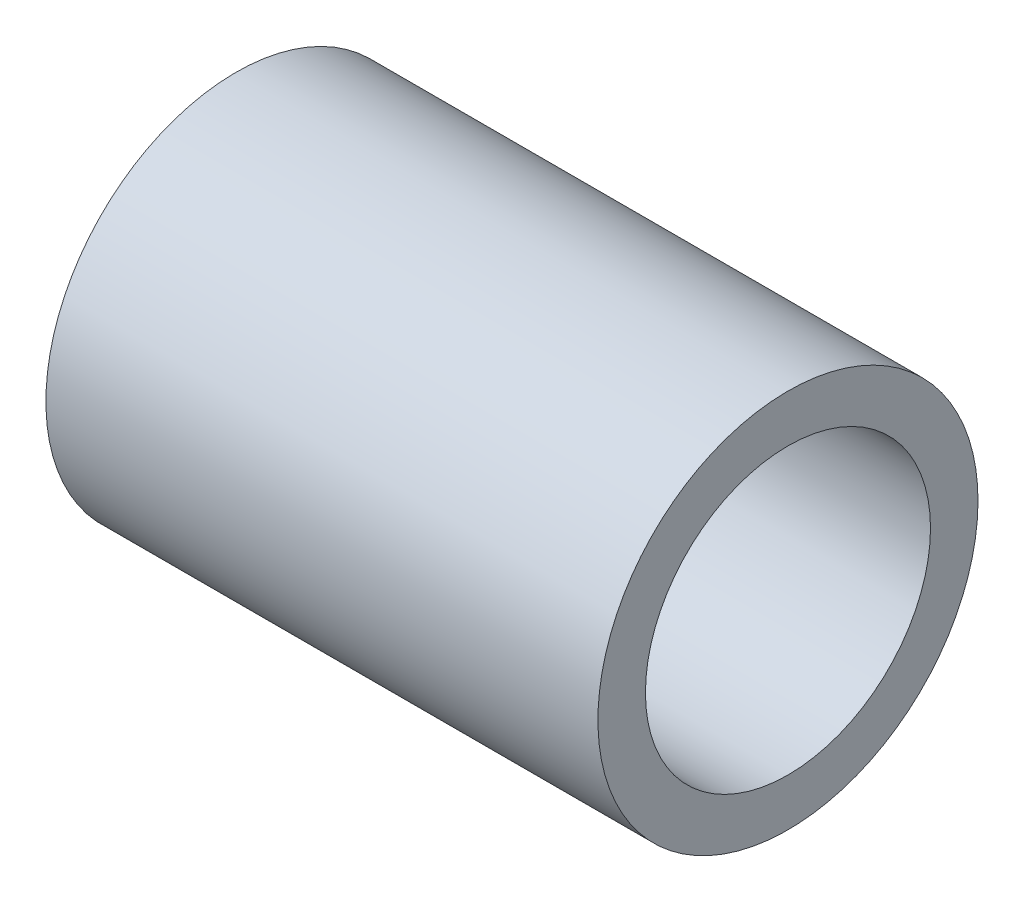
ISO-10303-21;
HEADER;
FILE_DESCRIPTION(('STEP AP214'),'2;1');
FILE_NAME('part.step','',(''),(''),'','','');
FILE_SCHEMA(('AUTOMOTIVE_DESIGN { 1 0 10303 214 1 1 1 1 }'));
ENDSEC;
DATA;
#1=APPLICATION_CONTEXT('core data for automotive mechanical design processes');
#2=APPLICATION_PROTOCOL_DEFINITION('international standard','automotive_design',2000,#1);
#3=PRODUCT_CONTEXT('',#1,'mechanical');
#4=PRODUCT('Part','Part','',(#3));
#5=PRODUCT_RELATED_PRODUCT_CATEGORY('part','',(#4));
#6=PRODUCT_DEFINITION_FORMATION('','',#4);
#7=PRODUCT_DEFINITION_CONTEXT('part definition',#1,'design');
#8=PRODUCT_DEFINITION('design','',#6,#7);
#9=PRODUCT_DEFINITION_SHAPE('','',#8);
#10=(LENGTH_UNIT() NAMED_UNIT(*) SI_UNIT(.MILLI.,.METRE.));
#11=(NAMED_UNIT(*) PLANE_ANGLE_UNIT() SI_UNIT($,.RADIAN.));
#12=(NAMED_UNIT(*) SI_UNIT($,.STERADIAN.) SOLID_ANGLE_UNIT());
#13=UNCERTAINTY_MEASURE_WITH_UNIT(LENGTH_MEASURE(1.E-05),#10,'distance_accuracy_value','');
#14=(GEOMETRIC_REPRESENTATION_CONTEXT(3) GLOBAL_UNCERTAINTY_ASSIGNED_CONTEXT((#13)) GLOBAL_UNIT_ASSIGNED_CONTEXT((#10,
#11,#12)) REPRESENTATION_CONTEXT('',''));
#15=CARTESIAN_POINT('',(0.,0.,0.));
#16=DIRECTION('',(0.,0.,1.));
#17=DIRECTION('',(1.,0.,0.));
#18=AXIS2_PLACEMENT_3D('',#15,#16,#17);
#19=CARTESIAN_POINT('',(-92.500000000003,37.9999999999994,48.9181547372543));
#20=DIRECTION('',(-1.,0.,0.));
#21=DIRECTION('',(0.,-0.304489416854202,0.952515719042887));
#22=AXIS2_PLACEMENT_3D('',#19,#20,#21);
#23=CYLINDRICAL_SURFACE('',#22,4.2);
#24=CARTESIAN_POINT('',(-92.500000000003,37.9999999999994,48.9181547372543));
#25=DIRECTION('',(1.,0.,0.));
#26=DIRECTION('',(0.,0.304489416854202,-0.952515719042887));
#27=AXIS2_PLACEMENT_3D('',#24,#25,#26);
#28=CIRCLE('',#27,4.2);
#29=CARTESIAN_POINT('',(-92.500000000003,39.278855550787,44.9175887172742));
#30=VERTEX_POINT('',#29);
#31=EDGE_CURVE('E10',#30,#30,#28,.T.);
#32=ORIENTED_EDGE('',*,*,#31,.F.);
#33=EDGE_LOOP('',(#32));
#34=FACE_BOUND('',#33,.T.);
#35=CARTESIAN_POINT('',(-104.700000000003,37.9999999999994,48.9181547372543));
#36=DIRECTION('',(1.,0.,0.));
#37=DIRECTION('',(0.,0.304489416854202,-0.952515719042887));
#38=AXIS2_PLACEMENT_3D('',#35,#36,#37);
#39=CIRCLE('',#38,4.2);
#40=CARTESIAN_POINT('',(-104.700000000003,39.278855550787,44.9175887172742));
#41=VERTEX_POINT('',#40);
#42=EDGE_CURVE('E52',#41,#41,#39,.T.);
#43=ORIENTED_EDGE('',*,*,#42,.T.);
#44=EDGE_LOOP('',(#43));
#45=FACE_BOUND('',#44,.T.);
#46=ADVANCED_FACE('F46',(#34,#45),#23,.T.);
#47=CARTESIAN_POINT('',(-92.500000000003,41.5745745285111,52.8860216274688));
#48=DIRECTION('',(1.,0.,0.));
#49=DIRECTION('',(0.,1.,0.));
#50=AXIS2_PLACEMENT_3D('',#47,#48,#49);
#51=PLANE('',#50);
#52=CARTESIAN_POINT('',(-92.500000000003,37.9999999999994,48.9181547372543));
#53=DIRECTION('',(1.,0.,0.));
#54=DIRECTION('',(0.,0.,-1.));
#55=AXIS2_PLACEMENT_3D('',#52,#53,#54);
#56=CIRCLE('',#55,3.15);
#57=CARTESIAN_POINT('',(-92.500000000003,37.9999999999994,45.7681547372543));
#58=VERTEX_POINT('',#57);
#59=EDGE_CURVE('E64',#58,#58,#56,.F.);
#60=ORIENTED_EDGE('',*,*,#59,.T.);
#61=EDGE_LOOP('',(#60));
#62=FACE_BOUND('',#61,.T.);
#63=ORIENTED_EDGE('',*,*,#31,.T.);
#64=EDGE_LOOP('',(#63));
#65=FACE_BOUND('',#64,.T.);
#66=ADVANCED_FACE('F73',(#62,#65),#51,.T.);
#67=CARTESIAN_POINT('',(-104.700000000003,41.5745745285111,52.8860216274688));
#68=DIRECTION('',(1.,0.,0.));
#69=DIRECTION('',(0.,1.,0.));
#70=AXIS2_PLACEMENT_3D('',#67,#68,#69);
#71=PLANE('',#70);
#72=CARTESIAN_POINT('',(-104.700000000003,37.9999999999994,48.9181547372543));
#73=DIRECTION('',(-1.,0.,0.));
#74=DIRECTION('',(0.,0.,1.));
#75=AXIS2_PLACEMENT_3D('',#72,#73,#74);
#76=CIRCLE('',#75,3.15);
#77=CARTESIAN_POINT('',(-104.700000000003,37.9999999999994,52.0681547372543));
#78=VERTEX_POINT('',#77);
#79=EDGE_CURVE('E58',#78,#78,#76,.T.);
#80=ORIENTED_EDGE('',*,*,#79,.F.);
#81=EDGE_LOOP('',(#80));
#82=FACE_BOUND('',#81,.T.);
#83=ORIENTED_EDGE('',*,*,#42,.F.);
#84=EDGE_LOOP('',(#83));
#85=FACE_BOUND('',#84,.T.);
#86=ADVANCED_FACE('F74',(#82,#85),#71,.F.);
#87=CARTESIAN_POINT('',(-83.5904545570525,37.9999999999994,48.9181547372543));
#88=DIRECTION('',(-1.,0.,0.));
#89=DIRECTION('',(0.,0.,1.));
#90=AXIS2_PLACEMENT_3D('',#87,#88,#89);
#91=CYLINDRICAL_SURFACE('',#90,3.15);
#92=ORIENTED_EDGE('',*,*,#79,.T.);
#93=EDGE_LOOP('',(#92));
#94=FACE_BOUND('',#93,.T.);
#95=ORIENTED_EDGE('',*,*,#59,.F.);
#96=EDGE_LOOP('',(#95));
#97=FACE_BOUND('',#96,.T.);
#98=ADVANCED_FACE('F71',(#94,#97),#91,.F.);
#99=CLOSED_SHELL('',(#46,#66,#86,#98));
#100=MANIFOLD_SOLID_BREP('B2',#99);
#101=ADVANCED_BREP_SHAPE_REPRESENTATION('',(#18,#100),#14);
#102=SHAPE_DEFINITION_REPRESENTATION(#9,#101);
ENDSEC;
END-ISO-10303-21;
